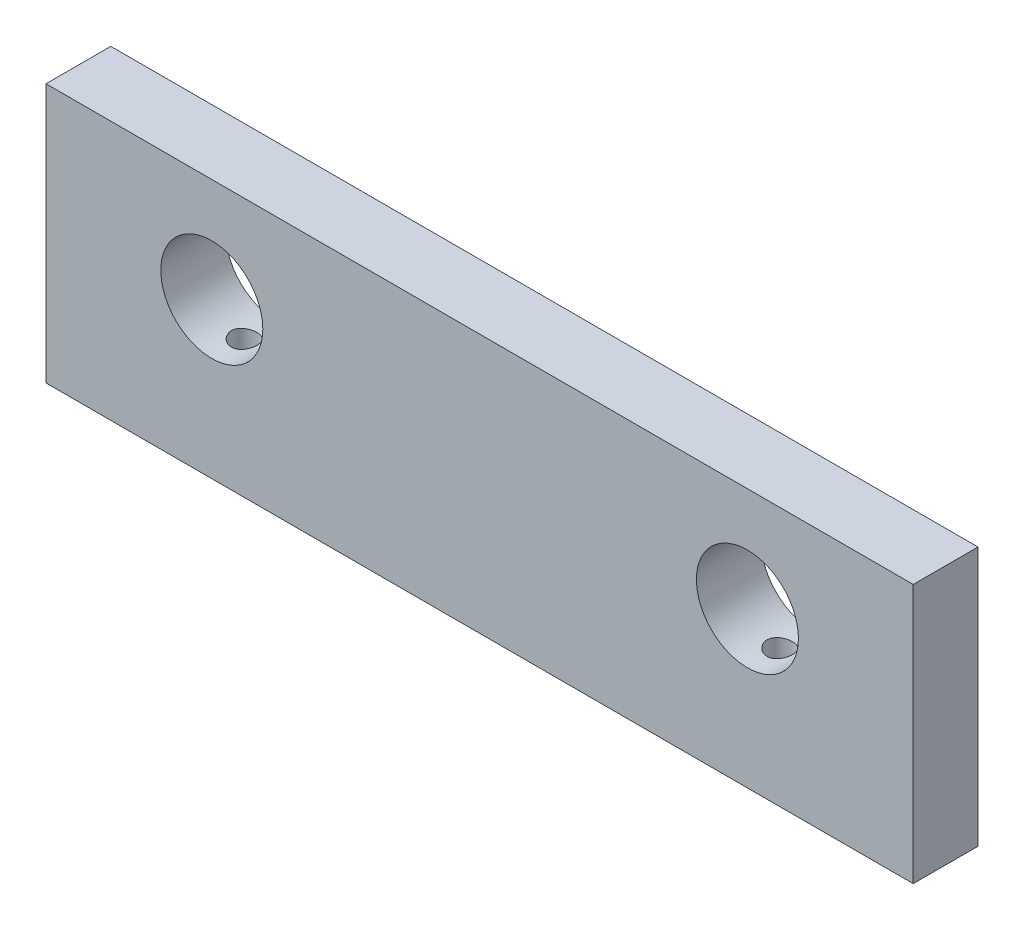
ISO-10303-21;
HEADER;
FILE_DESCRIPTION(('STEP AP214'),'2;1');
FILE_NAME('part.step','',(''),(''),'','','');
FILE_SCHEMA(('AUTOMOTIVE_DESIGN { 1 0 10303 214 1 1 1 1 }'));
ENDSEC;
DATA;
#1=APPLICATION_CONTEXT('core data for automotive mechanical design processes');
#2=APPLICATION_PROTOCOL_DEFINITION('international standard','automotive_design',2000,#1);
#3=PRODUCT_CONTEXT('',#1,'mechanical');
#4=PRODUCT('Part','Part','',(#3));
#5=PRODUCT_RELATED_PRODUCT_CATEGORY('part','',(#4));
#6=PRODUCT_DEFINITION_FORMATION('','',#4);
#7=PRODUCT_DEFINITION_CONTEXT('part definition',#1,'design');
#8=PRODUCT_DEFINITION('design','',#6,#7);
#9=PRODUCT_DEFINITION_SHAPE('','',#8);
#10=(LENGTH_UNIT() NAMED_UNIT(*) SI_UNIT(.MILLI.,.METRE.));
#11=(NAMED_UNIT(*) PLANE_ANGLE_UNIT() SI_UNIT($,.RADIAN.));
#12=(NAMED_UNIT(*) SI_UNIT($,.STERADIAN.) SOLID_ANGLE_UNIT());
#13=UNCERTAINTY_MEASURE_WITH_UNIT(LENGTH_MEASURE(1.E-05),#10,'distance_accuracy_value','');
#14=(GEOMETRIC_REPRESENTATION_CONTEXT(3) GLOBAL_UNCERTAINTY_ASSIGNED_CONTEXT((#13)) GLOBAL_UNIT_ASSIGNED_CONTEXT((#10,
#11,#12)) REPRESENTATION_CONTEXT('',''));
#15=CARTESIAN_POINT('',(0.,0.,0.));
#16=DIRECTION('',(0.,0.,1.));
#17=DIRECTION('',(1.,0.,0.));
#18=AXIS2_PLACEMENT_3D('',#15,#16,#17);
#19=CARTESIAN_POINT('',(-85.,0.,12.7));
#20=DIRECTION('',(-1.,0.,0.));
#21=DIRECTION('',(0.,0.,1.));
#22=AXIS2_PLACEMENT_3D('',#19,#20,#21);
#23=PLANE('',#22);
#24=DIRECTION('',(0.,1.,0.));
#25=VECTOR('',#24,1.);
#26=CARTESIAN_POINT('',(-85.,0.,0.));
#27=LINE('',#26,#25);
#28=CARTESIAN_POINT('',(-85.,-25.4,0.));
#29=VERTEX_POINT('',#28);
#30=CARTESIAN_POINT('',(-85.,25.4,0.));
#31=VERTEX_POINT('',#30);
#32=EDGE_CURVE('E115',#29,#31,#27,.T.);
#33=ORIENTED_EDGE('',*,*,#32,.F.);
#34=DIRECTION('',(0.,0.,-1.));
#35=VECTOR('',#34,1.);
#36=CARTESIAN_POINT('',(-85.,-25.4,12.7));
#37=LINE('',#36,#35);
#38=CARTESIAN_POINT('',(-85.,-25.4,12.7));
#39=VERTEX_POINT('',#38);
#40=EDGE_CURVE('E11',#39,#29,#37,.T.);
#41=ORIENTED_EDGE('',*,*,#40,.F.);
#42=DIRECTION('',(0.,1.,0.));
#43=VECTOR('',#42,1.);
#44=CARTESIAN_POINT('',(-85.,0.,12.7));
#45=LINE('',#44,#43);
#46=CARTESIAN_POINT('',(-85.,25.4,12.7));
#47=VERTEX_POINT('',#46);
#48=EDGE_CURVE('E101',#39,#47,#45,.T.);
#49=ORIENTED_EDGE('',*,*,#48,.T.);
#50=DIRECTION('',(0.,0.,-1.));
#51=VECTOR('',#50,1.);
#52=CARTESIAN_POINT('',(-85.,25.4,12.7));
#53=LINE('',#52,#51);
#54=EDGE_CURVE('E79',#47,#31,#53,.T.);
#55=ORIENTED_EDGE('',*,*,#54,.T.);
#56=EDGE_LOOP('',(#33,#41,#49,#55));
#57=FACE_BOUND('',#56,.T.);
#58=ADVANCED_FACE('F33',(#57),#23,.T.);
#59=CARTESIAN_POINT('',(0.,-25.4,12.7));
#60=DIRECTION('',(0.,-1.,0.));
#61=DIRECTION('',(1.,0.,0.));
#62=AXIS2_PLACEMENT_3D('',#59,#60,#61);
#63=PLANE('',#62);
#64=CARTESIAN_POINT('',(73.,-25.4,6.35000000000048));
#65=DIRECTION('',(0.,-1.,0.));
#66=DIRECTION('',(-1.,0.,0.));
#67=AXIS2_PLACEMENT_3D('',#64,#65,#66);
#68=CIRCLE('',#67,2.49999999999999);
#69=CARTESIAN_POINT('',(70.5,-25.4,6.35000000000048));
#70=VERTEX_POINT('',#69);
#71=EDGE_CURVE('E262',#70,#70,#68,.T.);
#72=ORIENTED_EDGE('',*,*,#71,.F.);
#73=EDGE_LOOP('',(#72));
#74=FACE_BOUND('',#73,.T.);
#75=CARTESIAN_POINT('',(-73.0000000000001,-25.4,6.35));
#76=DIRECTION('',(0.,-1.,0.));
#77=DIRECTION('',(1.,0.,0.));
#78=AXIS2_PLACEMENT_3D('',#75,#76,#77);
#79=CIRCLE('',#78,2.49999999999999);
#80=CARTESIAN_POINT('',(-70.5000000000001,-25.4,6.35));
#81=VERTEX_POINT('',#80);
#82=EDGE_CURVE('E261',#81,#81,#79,.T.);
#83=ORIENTED_EDGE('',*,*,#82,.F.);
#84=EDGE_LOOP('',(#83));
#85=FACE_BOUND('',#84,.T.);
#86=CARTESIAN_POINT('',(52.5,-25.4,6.35));
#87=DIRECTION('',(0.,-1.,0.));
#88=DIRECTION('',(1.,0.,0.));
#89=AXIS2_PLACEMENT_3D('',#86,#87,#88);
#90=CIRCLE('',#89,2.5);
#91=CARTESIAN_POINT('',(55.,-25.4,6.35));
#92=VERTEX_POINT('',#91);
#93=EDGE_CURVE('E271',#92,#92,#90,.T.);
#94=ORIENTED_EDGE('',*,*,#93,.F.);
#95=EDGE_LOOP('',(#94));
#96=FACE_BOUND('',#95,.T.);
#97=CARTESIAN_POINT('',(-52.5,-25.4,6.35));
#98=DIRECTION('',(0.,-1.,0.));
#99=DIRECTION('',(1.,0.,0.));
#100=AXIS2_PLACEMENT_3D('',#97,#98,#99);
#101=CIRCLE('',#100,2.5);
#102=CARTESIAN_POINT('',(-50.,-25.4,6.35));
#103=VERTEX_POINT('',#102);
#104=EDGE_CURVE('E127',#103,#103,#101,.T.);
#105=ORIENTED_EDGE('',*,*,#104,.F.);
#106=EDGE_LOOP('',(#105));
#107=FACE_BOUND('',#106,.T.);
#108=DIRECTION('',(-1.,0.,0.));
#109=VECTOR('',#108,1.);
#110=CARTESIAN_POINT('',(0.,-25.4,0.));
#111=LINE('',#110,#109);
#112=CARTESIAN_POINT('',(85.,-25.4,0.));
#113=VERTEX_POINT('',#112);
#114=EDGE_CURVE('E91',#113,#29,#111,.T.);
#115=ORIENTED_EDGE('',*,*,#114,.F.);
#116=DIRECTION('',(0.,0.,-1.));
#117=VECTOR('',#116,1.);
#118=CARTESIAN_POINT('',(85.,-25.4,12.7));
#119=LINE('',#118,#117);
#120=CARTESIAN_POINT('',(85.,-25.4,12.7));
#121=VERTEX_POINT('',#120);
#122=EDGE_CURVE('E47',#121,#113,#119,.T.);
#123=ORIENTED_EDGE('',*,*,#122,.F.);
#124=DIRECTION('',(-1.,0.,0.));
#125=VECTOR('',#124,1.);
#126=CARTESIAN_POINT('',(0.,-25.4,12.7));
#127=LINE('',#126,#125);
#128=EDGE_CURVE('E89',#121,#39,#127,.T.);
#129=ORIENTED_EDGE('',*,*,#128,.T.);
#130=ORIENTED_EDGE('',*,*,#40,.T.);
#131=EDGE_LOOP('',(#115,#123,#129,#130));
#132=FACE_BOUND('',#131,.T.);
#133=ADVANCED_FACE('F87',(#74,#85,#96,#107,#132),#63,.T.);
#134=CARTESIAN_POINT('',(85.,0.,12.7));
#135=DIRECTION('',(-1.,0.,0.));
#136=DIRECTION('',(0.,0.,1.));
#137=AXIS2_PLACEMENT_3D('',#134,#135,#136);
#138=PLANE('',#137);
#139=DIRECTION('',(0.,1.,0.));
#140=VECTOR('',#139,1.);
#141=CARTESIAN_POINT('',(85.,0.,0.));
#142=LINE('',#141,#140);
#143=CARTESIAN_POINT('',(85.,25.4,0.));
#144=VERTEX_POINT('',#143);
#145=EDGE_CURVE('E118',#113,#144,#142,.T.);
#146=ORIENTED_EDGE('',*,*,#145,.T.);
#147=DIRECTION('',(0.,0.,-1.));
#148=VECTOR('',#147,1.);
#149=CARTESIAN_POINT('',(85.,25.4,12.7));
#150=LINE('',#149,#148);
#151=CARTESIAN_POINT('',(85.,25.4,12.7));
#152=VERTEX_POINT('',#151);
#153=EDGE_CURVE('E94',#152,#144,#150,.T.);
#154=ORIENTED_EDGE('',*,*,#153,.F.);
#155=DIRECTION('',(0.,1.,0.));
#156=VECTOR('',#155,1.);
#157=CARTESIAN_POINT('',(85.,0.,12.7));
#158=LINE('',#157,#156);
#159=EDGE_CURVE('E97',#121,#152,#158,.T.);
#160=ORIENTED_EDGE('',*,*,#159,.F.);
#161=ORIENTED_EDGE('',*,*,#122,.T.);
#162=EDGE_LOOP('',(#146,#154,#160,#161));
#163=FACE_BOUND('',#162,.T.);
#164=ADVANCED_FACE('F98',(#163),#138,.F.);
#165=CARTESIAN_POINT('',(-52.5,5.,12.7));
#166=DIRECTION('',(0.,0.,-1.));
#167=DIRECTION('',(-1.,0.,0.));
#168=AXIS2_PLACEMENT_3D('',#165,#166,#167);
#169=CYLINDRICAL_SURFACE('',#168,9.99999999999999);
#170=CARTESIAN_POINT('',(-50.,-4.68245836551854,6.35));
#171=CARTESIAN_POINT('',(-50.0000039214069,-4.6824610008786,6.21194924907342));
#172=CARTESIAN_POINT('',(-50.0114737545023,-4.68544306014597,6.07385510132148));
#173=CARTESIAN_POINT('',(-50.0569768745362,-4.69701861992564,5.80163242182649));
#174=CARTESIAN_POINT('',(-50.0910232932579,-4.7056153862163,5.66750624553181));
#175=CARTESIAN_POINT('',(-50.180508800368,-4.7273872459615,5.40719646181282));
#176=CARTESIAN_POINT('',(-50.2359202721455,-4.74055642690457,5.28100284461429));
#177=CARTESIAN_POINT('',(-50.3664788587386,-4.76998192028758,5.03968914746012));
#178=CARTESIAN_POINT('',(-50.4416268114393,-4.78623836378489,4.92456953791978));
#179=CARTESIAN_POINT('',(-50.6112915726881,-4.82040716355624,4.70613835473779));
#180=CARTESIAN_POINT('',(-50.7061631122959,-4.83834597623033,4.60310639964995));
#181=CARTESIAN_POINT('',(-50.9118179358993,-4.87362875515293,4.41423860563966));
#182=CARTESIAN_POINT('',(-51.0226027058197,-4.89097266566388,4.32840437437825));
#183=CARTESIAN_POINT('',(-51.258854798921,-4.92340415520582,4.17522453236872));
#184=CARTESIAN_POINT('',(-51.3845054238049,-4.93845687400592,4.10815361183853));
#185=CARTESIAN_POINT('',(-51.6457368157072,-4.96430811925983,3.99619035584692));
#186=CARTESIAN_POINT('',(-51.7813161142081,-4.97510727334344,3.95129474808448));
#187=CARTESIAN_POINT('',(-52.0556412412458,-4.99104758848179,3.88585216542141));
#188=CARTESIAN_POINT('',(-52.194267280451,-4.99629893844313,3.86483035567342));
#189=CARTESIAN_POINT('',(-52.4731711807372,-5.00093594107297,3.84624162072444));
#190=CARTESIAN_POINT('',(-52.6134487945381,-5.00032246096704,3.8486712277904));
#191=CARTESIAN_POINT('',(-52.888380617931,-4.99338094953533,3.87657485025014));
#192=CARTESIAN_POINT('',(-53.0230905390027,-4.9871800234087,3.90153632505385));
#193=CARTESIAN_POINT('',(-53.2863456185342,-4.96990836524856,3.9729712700485));
#194=CARTESIAN_POINT('',(-53.4148904484261,-4.95883737398452,4.01944588537741));
#195=CARTESIAN_POINT('',(-53.6635167587545,-4.93287509700883,4.13300257068706));
#196=CARTESIAN_POINT('',(-53.7835112744163,-4.9179501969501,4.20026704466174));
#197=CARTESIAN_POINT('',(-54.0106890558512,-4.88589903809691,4.35335567911626));
#198=CARTESIAN_POINT('',(-54.1178700877138,-4.86877239652649,4.43918306856062));
#199=CARTESIAN_POINT('',(-54.3194350877124,-4.83363713769355,4.62970874198237));
#200=CARTESIAN_POINT('',(-54.413394197688,-4.81561719525296,4.73485489234775));
#201=CARTESIAN_POINT('',(-54.5824409399076,-4.78115043517326,4.95959997354028));
#202=CARTESIAN_POINT('',(-54.6575276901151,-4.76470369108288,5.07919957949111));
#203=CARTESIAN_POINT('',(-54.7869703225565,-4.73520496829318,5.33029003414886));
#204=CARTESIAN_POINT('',(-54.8412239174261,-4.72216983717006,5.4618357303128));
#205=CARTESIAN_POINT('',(-54.926714051591,-4.70118640148668,5.73258546807684));
#206=CARTESIAN_POINT('',(-54.9579555163827,-4.69323700842732,5.8717878639846));
#207=CARTESIAN_POINT('',(-54.9958296386659,-4.68355356007456,6.14995950152992));
#208=CARTESIAN_POINT('',(-55.0030904739191,-4.68166088976933,6.28883779334102));
#209=CARTESIAN_POINT('',(-54.9945169905152,-4.68387343364691,6.56582193658525));
#210=CARTESIAN_POINT('',(-54.9786847978498,-4.687978095703,6.70392785794944));
#211=CARTESIAN_POINT('',(-54.9249254639383,-4.70157081984978,6.97311426494857));
#212=CARTESIAN_POINT('',(-54.8873640682819,-4.71096970242531,7.1042727265692));
#213=CARTESIAN_POINT('',(-54.7916180816705,-4.73400718262804,7.35843145785333));
#214=CARTESIAN_POINT('',(-54.7334310477125,-4.74764628246407,7.48143075905578));
#215=CARTESIAN_POINT('',(-54.5967706679366,-4.77796137095511,7.71844127786689));
#216=CARTESIAN_POINT('',(-54.5179217538356,-4.79469168607244,7.83222884004298));
#217=CARTESIAN_POINT('',(-54.3426507323361,-4.82917083071112,8.04518836280147));
#218=CARTESIAN_POINT('',(-54.2462257370136,-4.84691982728306,8.14435791665011));
#219=CARTESIAN_POINT('',(-54.0356568024618,-4.88197403031773,8.32781104257093));
#220=CARTESIAN_POINT('',(-53.921129881329,-4.8992570206188,8.4116600625488));
#221=CARTESIAN_POINT('',(-53.6792567067367,-4.93097216613689,8.55893586695125));
#222=CARTESIAN_POINT('',(-53.551911122394,-4.94540447003948,8.62236371660821));
#223=CARTESIAN_POINT('',(-53.2888955043277,-4.96970115738324,8.72644603452793));
#224=CARTESIAN_POINT('',(-53.1532934525697,-4.97959830022409,8.76726428437906));
#225=CARTESIAN_POINT('',(-52.876874400797,-4.99385293395788,8.82546033460842));
#226=CARTESIAN_POINT('',(-52.7360584126031,-4.99821149393421,8.84284265873904));
#227=CARTESIAN_POINT('',(-52.4572911838917,-5.00085423522015,8.85341897393885));
#228=CARTESIAN_POINT('',(-52.319365432585,-4.99929947199971,8.84725427273852));
#229=CARTESIAN_POINT('',(-52.0465812589631,-4.99064741143608,8.81238043176413));
#230=CARTESIAN_POINT('',(-51.9117227455477,-4.98355027892922,8.78367196246708));
#231=CARTESIAN_POINT('',(-51.6495724108881,-4.96463582134722,8.70486945057285));
#232=CARTESIAN_POINT('',(-51.5222437635478,-4.9528441125598,8.65489136671405));
#233=CARTESIAN_POINT('',(-51.2777073673959,-4.92578222284144,8.53507355245107));
#234=CARTESIAN_POINT('',(-51.1605008968359,-4.91051160346894,8.46523131832379));
#235=CARTESIAN_POINT('',(-50.9364951789417,-4.87768124200718,8.30571191500967));
#236=CARTESIAN_POINT('',(-50.8300125292542,-4.86007542354161,8.21559964274043));
#237=CARTESIAN_POINT('',(-50.6334624493162,-4.82476622642974,8.01894287005664));
#238=CARTESIAN_POINT('',(-50.5433991873085,-4.80706282418255,7.91239420972209));
#239=CARTESIAN_POINT('',(-50.3805949338204,-4.77318689613755,7.68349646452635));
#240=CARTESIAN_POINT('',(-50.3082084514591,-4.75704909183222,7.56088969158687));
#241=CARTESIAN_POINT('',(-50.1851827585363,-4.7285988873707,7.30486127531295));
#242=CARTESIAN_POINT('',(-50.1345277256196,-4.71628370583034,7.17144758476539));
#243=CARTESIAN_POINT('',(-50.0639436785725,-4.69879771876843,6.9235574704121));
#244=CARTESIAN_POINT('',(-50.0400170735078,-4.69271657508747,6.81026708903466));
#245=CARTESIAN_POINT('',(-50.0080442685706,-4.6845459645655,6.58132782750578));
#246=CARTESIAN_POINT('',(-49.9999967140706,-4.68245615722769,6.465679149389));
#247=CARTESIAN_POINT('',(-50.,-4.68245836551854,6.35));
#248=B_SPLINE_CURVE_WITH_KNOTS('',3,(#170,#171,#172,#173,#174,#175,#176,#177,#178,#179,#180,
#181,#182,#183,#184,#185,#186,#187,#188,#189,#190,#191,#192,#193,#194,#195,#196,#197,#198,#199,
#200,#201,#202,#203,#204,#205,#206,#207,#208,#209,#210,#211,#212,#213,#214,#215,#216,#217,#218,
#219,#220,#221,#222,#223,#224,#225,#226,#227,#228,#229,#230,#231,#232,#233,#234,#235,#236,#237,
#238,#239,#240,#241,#242,#243,#244,#245,#246,#247),.UNSPECIFIED.,.T.,.F.,(4,2,2,2,2,2,2,2,2,2,2,
2,2,2,2,2,2,2,2,2,2,2,2,2,2,2,2,2,2,2,2,2,2,2,2,2,2,2,4),(0.,0.413727441736135,
0.827695741428666,1.24113072716602,1.65458326755478,2.07623954192976,2.49793521479867,
2.9255149639792,3.35303159847092,3.77188750995347,4.19068148666021,4.60018262688948,
5.00970556724786,5.42292874254445,5.83622385468914,6.26070466571913,6.68520531199803,
7.11176432008403,7.53823200129548,7.95343574764205,8.36860127188748,8.77697405014152,
9.18539521426364,9.60182845864103,10.0183301888999,10.4452533097026,10.872154157245,
11.2959207281187,11.7196054891398,12.131834461324,12.5440511738193,12.9540487656466,
13.3640980574302,13.7839709658702,14.2039503157046,14.6317647729113,15.0592672137502,
15.4059782718573,15.7526597510792),.UNSPECIFIED.);
#249=CARTESIAN_POINT('',(-50.,-4.68245836551854,6.35));
#250=VERTEX_POINT('',#249);
#251=EDGE_CURVE('E112',#250,#250,#248,.T.);
#252=ORIENTED_EDGE('',*,*,#251,.F.);
#253=EDGE_LOOP('',(#252));
#254=FACE_BOUND('',#253,.T.);
#255=CARTESIAN_POINT('',(-52.5,5.,12.7));
#256=DIRECTION('',(0.,0.,1.));
#257=DIRECTION('',(1.,0.,0.));
#258=AXIS2_PLACEMENT_3D('',#255,#256,#257);
#259=CIRCLE('',#258,9.99999999999999);
#260=CARTESIAN_POINT('',(-42.5,5.,12.7));
#261=VERTEX_POINT('',#260);
#262=EDGE_CURVE('E103',#261,#261,#259,.T.);
#263=ORIENTED_EDGE('',*,*,#262,.T.);
#264=EDGE_LOOP('',(#263));
#265=FACE_BOUND('',#264,.T.);
#266=CARTESIAN_POINT('',(-52.5,5.,0.));
#267=DIRECTION('',(0.,0.,1.));
#268=DIRECTION('',(1.,0.,0.));
#269=AXIS2_PLACEMENT_3D('',#266,#267,#268);
#270=CIRCLE('',#269,9.99999999999999);
#271=CARTESIAN_POINT('',(-42.5,5.,0.));
#272=VERTEX_POINT('',#271);
#273=EDGE_CURVE('E111',#272,#272,#270,.T.);
#274=ORIENTED_EDGE('',*,*,#273,.F.);
#275=EDGE_LOOP('',(#274));
#276=FACE_BOUND('',#275,.T.);
#277=ADVANCED_FACE('F128',(#254,#265,#276),#169,.F.);
#278=CARTESIAN_POINT('',(52.5,5.,12.7));
#279=DIRECTION('',(0.,0.,-1.));
#280=DIRECTION('',(-1.,0.,0.));
#281=AXIS2_PLACEMENT_3D('',#278,#279,#280);
#282=CYLINDRICAL_SURFACE('',#281,9.99999999999999);
#283=CARTESIAN_POINT('',(55.,-4.68245836551854,6.35));
#284=CARTESIAN_POINT('',(54.9999960785931,-4.6824610008786,6.21194924907342));
#285=CARTESIAN_POINT('',(54.9885262454976,-4.68544306014597,6.07385510132148));
#286=CARTESIAN_POINT('',(54.9430231254638,-4.69701861992564,5.80163242182649));
#287=CARTESIAN_POINT('',(54.9089767067421,-4.7056153862163,5.66750624553181));
#288=CARTESIAN_POINT('',(54.819491199632,-4.7273872459615,5.40719646181282));
#289=CARTESIAN_POINT('',(54.7640797278545,-4.74055642690457,5.28100284461429));
#290=CARTESIAN_POINT('',(54.6335211412614,-4.76998192028758,5.03968914746012));
#291=CARTESIAN_POINT('',(54.5583731885607,-4.78623836378489,4.92456953791978));
#292=CARTESIAN_POINT('',(54.3887084273119,-4.82040716355624,4.70613835473778));
#293=CARTESIAN_POINT('',(54.293836887704,-4.83834597623033,4.60310639964995));
#294=CARTESIAN_POINT('',(54.0881820641007,-4.87362875515293,4.41423860563966));
#295=CARTESIAN_POINT('',(53.9773972941803,-4.89097266566388,4.32840437437825));
#296=CARTESIAN_POINT('',(53.741145201079,-4.92340415520582,4.17522453236872));
#297=CARTESIAN_POINT('',(53.6154945761951,-4.93845687400592,4.10815361183853));
#298=CARTESIAN_POINT('',(53.3542631842928,-4.96430811925983,3.99619035584691));
#299=CARTESIAN_POINT('',(53.2186838857919,-4.97510727334344,3.95129474808448));
#300=CARTESIAN_POINT('',(52.9443587587542,-4.99104758848179,3.88585216542141));
#301=CARTESIAN_POINT('',(52.805732719549,-4.99629893844313,3.86483035567341));
#302=CARTESIAN_POINT('',(52.5268288192628,-5.00093594107297,3.84624162072444));
#303=CARTESIAN_POINT('',(52.3865512054619,-5.00032246096704,3.8486712277904));
#304=CARTESIAN_POINT('',(52.111619382069,-4.99338094953533,3.87657485025014));
#305=CARTESIAN_POINT('',(51.9769094609973,-4.9871800234087,3.90153632505385));
#306=CARTESIAN_POINT('',(51.7136543814658,-4.96990836524856,3.9729712700485));
#307=CARTESIAN_POINT('',(51.5851095515739,-4.95883737398452,4.01944588537741));
#308=CARTESIAN_POINT('',(51.3364832412455,-4.93287509700883,4.13300257068706));
#309=CARTESIAN_POINT('',(51.2164887255837,-4.9179501969501,4.20026704466174));
#310=CARTESIAN_POINT('',(50.9893109441488,-4.88589903809691,4.35335567911626));
#311=CARTESIAN_POINT('',(50.8821299122862,-4.86877239652649,4.43918306856062));
#312=CARTESIAN_POINT('',(50.6805649122876,-4.83363713769355,4.62970874198237));
#313=CARTESIAN_POINT('',(50.586605802312,-4.81561719525296,4.73485489234774));
#314=CARTESIAN_POINT('',(50.4175590600924,-4.78115043517326,4.95959997354028));
#315=CARTESIAN_POINT('',(50.3424723098849,-4.76470369108288,5.0791995794911));
#316=CARTESIAN_POINT('',(50.2130296774435,-4.73520496829318,5.33029003414886));
#317=CARTESIAN_POINT('',(50.1587760825739,-4.72216983717006,5.4618357303128));
#318=CARTESIAN_POINT('',(50.073285948409,-4.70118640148668,5.73258546807684));
#319=CARTESIAN_POINT('',(50.0420444836173,-4.69323700842732,5.87178786398459));
#320=CARTESIAN_POINT('',(50.0041703613341,-4.68355356007456,6.14995950152992));
#321=CARTESIAN_POINT('',(49.9969095260809,-4.68166088976933,6.28883779334102));
#322=CARTESIAN_POINT('',(50.0054830094848,-4.68387343364691,6.56582193658525));
#323=CARTESIAN_POINT('',(50.0213152021502,-4.687978095703,6.70392785794944));
#324=CARTESIAN_POINT('',(50.0750745360617,-4.70157081984979,6.97311426494857));
#325=CARTESIAN_POINT('',(50.1126359317181,-4.71096970242531,7.1042727265692));
#326=CARTESIAN_POINT('',(50.2083819183295,-4.73400718262804,7.35843145785333));
#327=CARTESIAN_POINT('',(50.2665689522875,-4.74764628246407,7.48143075905578));
#328=CARTESIAN_POINT('',(50.4032293320634,-4.77796137095511,7.7184412778669));
#329=CARTESIAN_POINT('',(50.4820782461643,-4.79469168607244,7.83222884004298));
#330=CARTESIAN_POINT('',(50.6573492676639,-4.82917083071112,8.04518836280147));
#331=CARTESIAN_POINT('',(50.7537742629864,-4.84691982728306,8.14435791665011));
#332=CARTESIAN_POINT('',(50.9643431975382,-4.88197403031773,8.32781104257092));
#333=CARTESIAN_POINT('',(51.078870118671,-4.8992570206188,8.41166006254881));
#334=CARTESIAN_POINT('',(51.3207432932633,-4.93097216613689,8.55893586695125));
#335=CARTESIAN_POINT('',(51.448088877606,-4.94540447003949,8.62236371660821));
#336=CARTESIAN_POINT('',(51.7111044956723,-4.96970115738324,8.72644603452793));
#337=CARTESIAN_POINT('',(51.8467065474303,-4.97959830022409,8.76726428437907));
#338=CARTESIAN_POINT('',(52.123125599203,-4.99385293395788,8.82546033460842));
#339=CARTESIAN_POINT('',(52.2639415873969,-4.99821149393421,8.84284265873904));
#340=CARTESIAN_POINT('',(52.5427088161083,-5.00085423522015,8.85341897393885));
#341=CARTESIAN_POINT('',(52.680634567415,-4.99929947199971,8.84725427273852));
#342=CARTESIAN_POINT('',(52.9534187410369,-4.99064741143608,8.81238043176413));
#343=CARTESIAN_POINT('',(53.0882772544523,-4.98355027892922,8.78367196246708));
#344=CARTESIAN_POINT('',(53.3504275891119,-4.96463582134722,8.70486945057285));
#345=CARTESIAN_POINT('',(53.4777562364522,-4.9528441125598,8.65489136671405));
#346=CARTESIAN_POINT('',(53.7222926326041,-4.92578222284144,8.53507355245107));
#347=CARTESIAN_POINT('',(53.8394991031641,-4.91051160346894,8.46523131832379));
#348=CARTESIAN_POINT('',(54.0635048210582,-4.87768124200717,8.30571191500967));
#349=CARTESIAN_POINT('',(54.1699874707458,-4.86007542354161,8.21559964274043));
#350=CARTESIAN_POINT('',(54.3665375506838,-4.82476622642974,8.01894287005663));
#351=CARTESIAN_POINT('',(54.4566008126915,-4.80706282418255,7.91239420972209));
#352=CARTESIAN_POINT('',(54.6194050661796,-4.77318689613755,7.68349646452635));
#353=CARTESIAN_POINT('',(54.6917915485409,-4.75704909183222,7.56088969158686));
#354=CARTESIAN_POINT('',(54.8148172414637,-4.7285988873707,7.30486127531295));
#355=CARTESIAN_POINT('',(54.8654722743804,-4.71628370583034,7.17144758476538));
#356=CARTESIAN_POINT('',(54.9360563214275,-4.69879771876843,6.9235574704121));
#357=CARTESIAN_POINT('',(54.9599829264922,-4.69271657508747,6.81026708903466));
#358=CARTESIAN_POINT('',(54.9919557314294,-4.6845459645655,6.58132782750578));
#359=CARTESIAN_POINT('',(55.0000032859294,-4.68245615722769,6.46567914938899));
#360=CARTESIAN_POINT('',(55.,-4.68245836551854,6.35));
#361=B_SPLINE_CURVE_WITH_KNOTS('',3,(#283,#284,#285,#286,#287,#288,#289,#290,#291,#292,#293,
#294,#295,#296,#297,#298,#299,#300,#301,#302,#303,#304,#305,#306,#307,#308,#309,#310,#311,#312,
#313,#314,#315,#316,#317,#318,#319,#320,#321,#322,#323,#324,#325,#326,#327,#328,#329,#330,#331,
#332,#333,#334,#335,#336,#337,#338,#339,#340,#341,#342,#343,#344,#345,#346,#347,#348,#349,#350,
#351,#352,#353,#354,#355,#356,#357,#358,#359,#360),.UNSPECIFIED.,.T.,.F.,(4,2,2,2,2,2,2,2,2,2,2,
2,2,2,2,2,2,2,2,2,2,2,2,2,2,2,2,2,2,2,2,2,2,2,2,2,2,2,4),(0.,0.413727441736135,
0.827695741428666,1.24113072716602,1.65458326755478,2.07623954192976,2.49793521479867,
2.9255149639792,3.35303159847092,3.77188750995347,4.19068148666021,4.60018262688947,
5.00970556724786,5.42292874254445,5.83622385468914,6.26070466571912,6.68520531199803,
7.11176432008403,7.53823200129548,7.95343574764205,8.36860127188748,8.77697405014153,
9.18539521426363,9.60182845864103,10.0183301888999,10.4452533097027,10.872154157245,
11.2959207281188,11.7196054891398,12.131834461324,12.5440511738193,12.9540487656466,
13.3640980574302,13.7839709658702,14.2039503157046,14.6317647729113,15.0592672137502,
15.4059782718573,15.7526597510792),.UNSPECIFIED.);
#362=CARTESIAN_POINT('',(55.,-4.68245836551854,6.35));
#363=VERTEX_POINT('',#362);
#364=EDGE_CURVE('E38',#363,#363,#361,.T.);
#365=ORIENTED_EDGE('',*,*,#364,.F.);
#366=EDGE_LOOP('',(#365));
#367=FACE_BOUND('',#366,.T.);
#368=CARTESIAN_POINT('',(52.5,5.,12.7));
#369=DIRECTION('',(0.,0.,1.));
#370=DIRECTION('',(1.,0.,0.));
#371=AXIS2_PLACEMENT_3D('',#368,#369,#370);
#372=CIRCLE('',#371,9.99999999999999);
#373=CARTESIAN_POINT('',(62.5,5.,12.7));
#374=VERTEX_POINT('',#373);
#375=EDGE_CURVE('E121',#374,#374,#372,.T.);
#376=ORIENTED_EDGE('',*,*,#375,.T.);
#377=EDGE_LOOP('',(#376));
#378=FACE_BOUND('',#377,.T.);
#379=CARTESIAN_POINT('',(52.5,5.,0.));
#380=DIRECTION('',(0.,0.,1.));
#381=DIRECTION('',(1.,0.,0.));
#382=AXIS2_PLACEMENT_3D('',#379,#380,#381);
#383=CIRCLE('',#382,9.99999999999999);
#384=CARTESIAN_POINT('',(62.5,5.,0.));
#385=VERTEX_POINT('',#384);
#386=EDGE_CURVE('E108',#385,#385,#383,.T.);
#387=ORIENTED_EDGE('',*,*,#386,.F.);
#388=EDGE_LOOP('',(#387));
#389=FACE_BOUND('',#388,.T.);
#390=ADVANCED_FACE('F35',(#367,#378,#389),#282,.F.);
#391=CARTESIAN_POINT('',(0.,25.4,12.7));
#392=DIRECTION('',(0.,-1.,0.));
#393=DIRECTION('',(1.,0.,0.));
#394=AXIS2_PLACEMENT_3D('',#391,#392,#393);
#395=PLANE('',#394);
#396=DIRECTION('',(-1.,0.,0.));
#397=VECTOR('',#396,1.);
#398=CARTESIAN_POINT('',(0.,25.4,0.));
#399=LINE('',#398,#397);
#400=EDGE_CURVE('E72',#144,#31,#399,.T.);
#401=ORIENTED_EDGE('',*,*,#400,.T.);
#402=ORIENTED_EDGE('',*,*,#54,.F.);
#403=DIRECTION('',(-1.,0.,0.));
#404=VECTOR('',#403,1.);
#405=CARTESIAN_POINT('',(0.,25.4,12.7));
#406=LINE('',#405,#404);
#407=EDGE_CURVE('E56',#152,#47,#406,.T.);
#408=ORIENTED_EDGE('',*,*,#407,.F.);
#409=ORIENTED_EDGE('',*,*,#153,.T.);
#410=EDGE_LOOP('',(#401,#402,#408,#409));
#411=FACE_BOUND('',#410,.T.);
#412=ADVANCED_FACE('F142',(#411),#395,.F.);
#413=CARTESIAN_POINT('',(0.,0.,12.7));
#414=DIRECTION('',(0.,0.,1.));
#415=DIRECTION('',(1.,0.,0.));
#416=AXIS2_PLACEMENT_3D('',#413,#414,#415);
#417=PLANE('',#416);
#418=ORIENTED_EDGE('',*,*,#375,.F.);
#419=EDGE_LOOP('',(#418));
#420=FACE_BOUND('',#419,.T.);
#421=ORIENTED_EDGE('',*,*,#262,.F.);
#422=EDGE_LOOP('',(#421));
#423=FACE_BOUND('',#422,.T.);
#424=ORIENTED_EDGE('',*,*,#48,.F.);
#425=ORIENTED_EDGE('',*,*,#128,.F.);
#426=ORIENTED_EDGE('',*,*,#159,.T.);
#427=ORIENTED_EDGE('',*,*,#407,.T.);
#428=EDGE_LOOP('',(#424,#425,#426,#427));
#429=FACE_BOUND('',#428,.T.);
#430=ADVANCED_FACE('F100',(#420,#423,#429),#417,.T.);
#431=CARTESIAN_POINT('',(0.,0.,0.));
#432=DIRECTION('',(0.,0.,1.));
#433=DIRECTION('',(1.,0.,0.));
#434=AXIS2_PLACEMENT_3D('',#431,#432,#433);
#435=PLANE('',#434);
#436=ORIENTED_EDGE('',*,*,#386,.T.);
#437=EDGE_LOOP('',(#436));
#438=FACE_BOUND('',#437,.T.);
#439=ORIENTED_EDGE('',*,*,#273,.T.);
#440=EDGE_LOOP('',(#439));
#441=FACE_BOUND('',#440,.T.);
#442=ORIENTED_EDGE('',*,*,#32,.T.);
#443=ORIENTED_EDGE('',*,*,#400,.F.);
#444=ORIENTED_EDGE('',*,*,#145,.F.);
#445=ORIENTED_EDGE('',*,*,#114,.T.);
#446=EDGE_LOOP('',(#442,#443,#444,#445));
#447=FACE_BOUND('',#446,.T.);
#448=ADVANCED_FACE('F136',(#438,#441,#447),#435,.F.);
#449=CARTESIAN_POINT('',(-52.5,7.3,6.35));
#450=DIRECTION('',(0.,-1.,0.));
#451=DIRECTION('',(1.,0.,0.));
#452=AXIS2_PLACEMENT_3D('',#449,#450,#451);
#453=CYLINDRICAL_SURFACE('',#452,2.5);
#454=ORIENTED_EDGE('',*,*,#251,.T.);
#455=EDGE_LOOP('',(#454));
#456=FACE_BOUND('',#455,.T.);
#457=ORIENTED_EDGE('',*,*,#104,.T.);
#458=EDGE_LOOP('',(#457));
#459=FACE_BOUND('',#458,.T.);
#460=ADVANCED_FACE('F131',(#456,#459),#453,.F.);
#461=CARTESIAN_POINT('',(52.5,7.30000000000002,6.35));
#462=DIRECTION('',(0.,-1.,0.));
#463=DIRECTION('',(1.,0.,0.));
#464=AXIS2_PLACEMENT_3D('',#461,#462,#463);
#465=CYLINDRICAL_SURFACE('',#464,2.5);
#466=ORIENTED_EDGE('',*,*,#364,.T.);
#467=EDGE_LOOP('',(#466));
#468=FACE_BOUND('',#467,.T.);
#469=ORIENTED_EDGE('',*,*,#93,.T.);
#470=EDGE_LOOP('',(#469));
#471=FACE_BOUND('',#470,.T.);
#472=ADVANCED_FACE('F135',(#468,#471),#465,.F.);
#473=CARTESIAN_POINT('',(-73.0000000000001,14.6,6.35));
#474=DIRECTION('',(0.,-1.,0.));
#475=DIRECTION('',(1.,0.,0.));
#476=AXIS2_PLACEMENT_3D('',#473,#474,#475);
#477=CYLINDRICAL_SURFACE('',#476,2.49999999999999);
#478=CARTESIAN_POINT('',(-73.0000000000001,14.6,6.35));
#479=DIRECTION('',(0.,-1.,0.));
#480=DIRECTION('',(1.,0.,0.));
#481=AXIS2_PLACEMENT_3D('',#478,#479,#480);
#482=CIRCLE('',#481,2.49999999999999);
#483=CARTESIAN_POINT('',(-70.5000000000001,14.6,6.35));
#484=VERTEX_POINT('',#483);
#485=EDGE_CURVE('E265',#484,#484,#482,.T.);
#486=ORIENTED_EDGE('',*,*,#485,.F.);
#487=EDGE_LOOP('',(#486));
#488=FACE_BOUND('',#487,.T.);
#489=ORIENTED_EDGE('',*,*,#82,.T.);
#490=EDGE_LOOP('',(#489));
#491=FACE_BOUND('',#490,.T.);
#492=ADVANCED_FACE('F202',(#488,#491),#477,.F.);
#493=CARTESIAN_POINT('',(-73.0000000000001,14.6,6.35));
#494=DIRECTION('',(0.,-1.,0.));
#495=DIRECTION('',(1.,0.,0.));
#496=AXIS2_PLACEMENT_3D('',#493,#494,#495);
#497=PLANE('',#496);
#498=ORIENTED_EDGE('',*,*,#485,.T.);
#499=EDGE_LOOP('',(#498));
#500=FACE_BOUND('',#499,.T.);
#501=ADVANCED_FACE('F208',(#500),#497,.T.);
#502=CARTESIAN_POINT('',(73.,14.6,6.35000000000048));
#503=DIRECTION('',(0.,-1.,0.));
#504=DIRECTION('',(1.,0.,0.));
#505=AXIS2_PLACEMENT_3D('',#502,#503,#504);
#506=CYLINDRICAL_SURFACE('',#505,2.49999999999999);
#507=CARTESIAN_POINT('',(73.,14.6,6.35000000000048));
#508=DIRECTION('',(0.,-1.,0.));
#509=DIRECTION('',(-1.,0.,0.));
#510=AXIS2_PLACEMENT_3D('',#507,#508,#509);
#511=CIRCLE('',#510,2.49999999999999);
#512=CARTESIAN_POINT('',(70.5,14.6,6.35000000000048));
#513=VERTEX_POINT('',#512);
#514=EDGE_CURVE('E260',#513,#513,#511,.T.);
#515=ORIENTED_EDGE('',*,*,#514,.F.);
#516=EDGE_LOOP('',(#515));
#517=FACE_BOUND('',#516,.T.);
#518=ORIENTED_EDGE('',*,*,#71,.T.);
#519=EDGE_LOOP('',(#518));
#520=FACE_BOUND('',#519,.T.);
#521=ADVANCED_FACE('F215',(#517,#520),#506,.F.);
#522=CARTESIAN_POINT('',(73.,14.6,6.35000000000048));
#523=DIRECTION('',(0.,1.,0.));
#524=DIRECTION('',(-1.,0.,0.));
#525=AXIS2_PLACEMENT_3D('',#522,#523,#524);
#526=PLANE('',#525);
#527=ORIENTED_EDGE('',*,*,#514,.T.);
#528=EDGE_LOOP('',(#527));
#529=FACE_BOUND('',#528,.T.);
#530=ADVANCED_FACE('F223',(#529),#526,.F.);
#531=CLOSED_SHELL('',(#58,#133,#164,#277,#390,#412,#430,#448,#460,#472,#492,#501,#521,#530));
#532=MANIFOLD_SOLID_BREP('B2',#531);
#533=ADVANCED_BREP_SHAPE_REPRESENTATION('',(#18,#532),#14);
#534=SHAPE_DEFINITION_REPRESENTATION(#9,#533);
ENDSEC;
END-ISO-10303-21;
